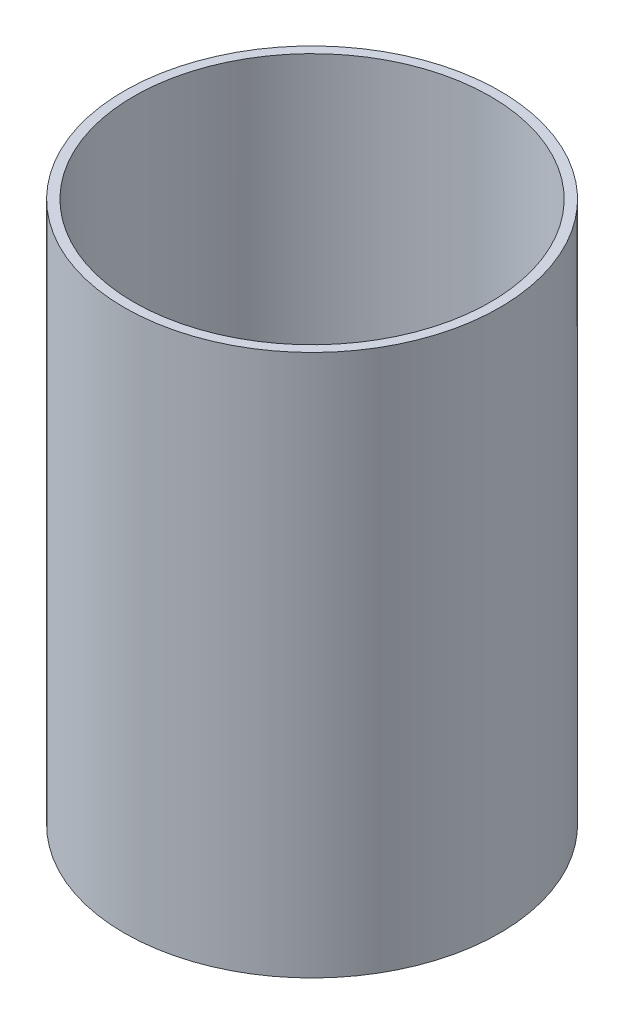
ISO-10303-21;
HEADER;
FILE_DESCRIPTION(('STEP AP214'),'2;1');
FILE_NAME('part.step','',(''),(''),'','','');
FILE_SCHEMA(('AUTOMOTIVE_DESIGN { 1 0 10303 214 1 1 1 1 }'));
ENDSEC;
DATA;
#1=APPLICATION_CONTEXT('core data for automotive mechanical design processes');
#2=APPLICATION_PROTOCOL_DEFINITION('international standard','automotive_design',2000,#1);
#3=PRODUCT_CONTEXT('',#1,'mechanical');
#4=PRODUCT('Part','Part','',(#3));
#5=PRODUCT_RELATED_PRODUCT_CATEGORY('part','',(#4));
#6=PRODUCT_DEFINITION_FORMATION('','',#4);
#7=PRODUCT_DEFINITION_CONTEXT('part definition',#1,'design');
#8=PRODUCT_DEFINITION('design','',#6,#7);
#9=PRODUCT_DEFINITION_SHAPE('','',#8);
#10=(LENGTH_UNIT() NAMED_UNIT(*) SI_UNIT(.MILLI.,.METRE.));
#11=(NAMED_UNIT(*) PLANE_ANGLE_UNIT() SI_UNIT($,.RADIAN.));
#12=(NAMED_UNIT(*) SI_UNIT($,.STERADIAN.) SOLID_ANGLE_UNIT());
#13=UNCERTAINTY_MEASURE_WITH_UNIT(LENGTH_MEASURE(1.E-05),#10,'distance_accuracy_value','');
#14=(GEOMETRIC_REPRESENTATION_CONTEXT(3) GLOBAL_UNCERTAINTY_ASSIGNED_CONTEXT((#13)) GLOBAL_UNIT_ASSIGNED_CONTEXT((#10,
#11,#12)) REPRESENTATION_CONTEXT('',''));
#15=CARTESIAN_POINT('',(0.,0.,0.));
#16=DIRECTION('',(0.,0.,1.));
#17=DIRECTION('',(1.,0.,0.));
#18=AXIS2_PLACEMENT_3D('',#15,#16,#17);
#19=CARTESIAN_POINT('',(0.,145.8595,0.));
#20=DIRECTION('',(0.,-1.,0.));
#21=DIRECTION('',(0.,0.,-1.));
#22=AXIS2_PLACEMENT_3D('',#19,#20,#21);
#23=CYLINDRICAL_SURFACE('',#22,48.006);
#24=CARTESIAN_POINT('',(0.,145.8595,0.));
#25=DIRECTION('',(0.,1.,0.));
#26=DIRECTION('',(0.,0.,1.));
#27=AXIS2_PLACEMENT_3D('',#24,#25,#26);
#28=CIRCLE('',#27,48.006);
#29=CARTESIAN_POINT('',(0.,145.8595,48.006));
#30=VERTEX_POINT('',#29);
#31=EDGE_CURVE('E50',#30,#30,#28,.T.);
#32=ORIENTED_EDGE('',*,*,#31,.T.);
#33=EDGE_LOOP('',(#32));
#34=FACE_BOUND('',#33,.T.);
#35=CARTESIAN_POINT('',(0.,1.98119999999999,0.));
#36=DIRECTION('',(0.,-1.,0.));
#37=DIRECTION('',(0.,0.,-1.));
#38=AXIS2_PLACEMENT_3D('',#35,#36,#37);
#39=CIRCLE('',#38,48.006);
#40=CARTESIAN_POINT('',(0.,1.98119999999999,-48.006));
#41=VERTEX_POINT('',#40);
#42=EDGE_CURVE('E41',#41,#41,#39,.T.);
#43=ORIENTED_EDGE('',*,*,#42,.T.);
#44=EDGE_LOOP('',(#43));
#45=FACE_BOUND('',#44,.T.);
#46=ADVANCED_FACE('F37',(#34,#45),#23,.F.);
#47=CARTESIAN_POINT('',(0.,145.8595,0.));
#48=DIRECTION('',(0.,1.,0.));
#49=DIRECTION('',(0.,0.,1.));
#50=AXIS2_PLACEMENT_3D('',#47,#48,#49);
#51=PLANE('',#50);
#52=CARTESIAN_POINT('',(0.,145.8595,0.));
#53=DIRECTION('',(0.,1.,0.));
#54=DIRECTION('',(0.,0.,1.));
#55=AXIS2_PLACEMENT_3D('',#52,#53,#54);
#56=CIRCLE('',#55,50.546);
#57=CARTESIAN_POINT('',(0.,145.8595,50.546));
#58=VERTEX_POINT('',#57);
#59=EDGE_CURVE('E10',#58,#58,#56,.T.);
#60=ORIENTED_EDGE('',*,*,#59,.T.);
#61=EDGE_LOOP('',(#60));
#62=FACE_BOUND('',#61,.T.);
#63=ORIENTED_EDGE('',*,*,#31,.F.);
#64=EDGE_LOOP('',(#63));
#65=FACE_BOUND('',#64,.T.);
#66=ADVANCED_FACE('F81',(#62,#65),#51,.T.);
#67=CARTESIAN_POINT('',(0.,0.,0.));
#68=DIRECTION('',(0.,1.,0.));
#69=DIRECTION('',(0.,0.,1.));
#70=AXIS2_PLACEMENT_3D('',#67,#68,#69);
#71=PLANE('',#70);
#72=CARTESIAN_POINT('',(0.,0.,28.575));
#73=DIRECTION('',(0.,1.,0.));
#74=DIRECTION('',(0.,0.,1.));
#75=AXIS2_PLACEMENT_3D('',#72,#73,#74);
#76=CIRCLE('',#75,14.605);
#77=CARTESIAN_POINT('',(0.,0.,43.18));
#78=VERTEX_POINT('',#77);
#79=EDGE_CURVE('E57',#78,#78,#76,.T.);
#80=ORIENTED_EDGE('',*,*,#79,.T.);
#81=EDGE_LOOP('',(#80));
#82=FACE_BOUND('',#81,.T.);
#83=CARTESIAN_POINT('',(0.,0.,0.));
#84=DIRECTION('',(0.,1.,0.));
#85=DIRECTION('',(0.,0.,1.));
#86=AXIS2_PLACEMENT_3D('',#83,#84,#85);
#87=CIRCLE('',#86,50.546);
#88=CARTESIAN_POINT('',(0.,0.,50.546));
#89=VERTEX_POINT('',#88);
#90=EDGE_CURVE('E45',#89,#89,#87,.T.);
#91=ORIENTED_EDGE('',*,*,#90,.F.);
#92=EDGE_LOOP('',(#91));
#93=FACE_BOUND('',#92,.T.);
#94=ADVANCED_FACE('F76',(#82,#93),#71,.F.);
#95=CARTESIAN_POINT('',(0.,145.8595,0.));
#96=DIRECTION('',(0.,-1.,0.));
#97=DIRECTION('',(0.,0.,-1.));
#98=AXIS2_PLACEMENT_3D('',#95,#96,#97);
#99=CYLINDRICAL_SURFACE('',#98,50.546);
#100=ORIENTED_EDGE('',*,*,#90,.T.);
#101=EDGE_LOOP('',(#100));
#102=FACE_BOUND('',#101,.T.);
#103=ORIENTED_EDGE('',*,*,#59,.F.);
#104=EDGE_LOOP('',(#103));
#105=FACE_BOUND('',#104,.T.);
#106=ADVANCED_FACE('F39',(#102,#105),#99,.T.);
#107=CARTESIAN_POINT('',(0.,1.9812,0.));
#108=DIRECTION('',(0.,-1.,0.));
#109=DIRECTION('',(0.,0.,-1.));
#110=AXIS2_PLACEMENT_3D('',#107,#108,#109);
#111=PLANE('',#110);
#112=CARTESIAN_POINT('',(0.,1.9812,28.575));
#113=DIRECTION('',(0.,1.,0.));
#114=DIRECTION('',(0.,0.,1.));
#115=AXIS2_PLACEMENT_3D('',#112,#113,#114);
#116=CIRCLE('',#115,14.605);
#117=CARTESIAN_POINT('',(0.,1.9812,43.18));
#118=VERTEX_POINT('',#117);
#119=EDGE_CURVE('E54',#118,#118,#116,.T.);
#120=ORIENTED_EDGE('',*,*,#119,.F.);
#121=EDGE_LOOP('',(#120));
#122=FACE_BOUND('',#121,.T.);
#123=ORIENTED_EDGE('',*,*,#42,.F.);
#124=EDGE_LOOP('',(#123));
#125=FACE_BOUND('',#124,.T.);
#126=ADVANCED_FACE('F65',(#122,#125),#111,.F.);
#127=CARTESIAN_POINT('',(0.,0.,28.575));
#128=DIRECTION('',(0.,1.,0.));
#129=DIRECTION('',(0.,0.,1.));
#130=AXIS2_PLACEMENT_3D('',#127,#128,#129);
#131=CYLINDRICAL_SURFACE('',#130,14.605);
#132=ORIENTED_EDGE('',*,*,#79,.F.);
#133=EDGE_LOOP('',(#132));
#134=FACE_BOUND('',#133,.T.);
#135=ORIENTED_EDGE('',*,*,#119,.T.);
#136=EDGE_LOOP('',(#135));
#137=FACE_BOUND('',#136,.T.);
#138=ADVANCED_FACE('F67',(#134,#137),#131,.F.);
#139=CLOSED_SHELL('',(#46,#66,#94,#106,#126,#138));
#140=MANIFOLD_SOLID_BREP('B2',#139);
#141=ADVANCED_BREP_SHAPE_REPRESENTATION('',(#18,#140),#14);
#142=SHAPE_DEFINITION_REPRESENTATION(#9,#141);
ENDSEC;
END-ISO-10303-21;
